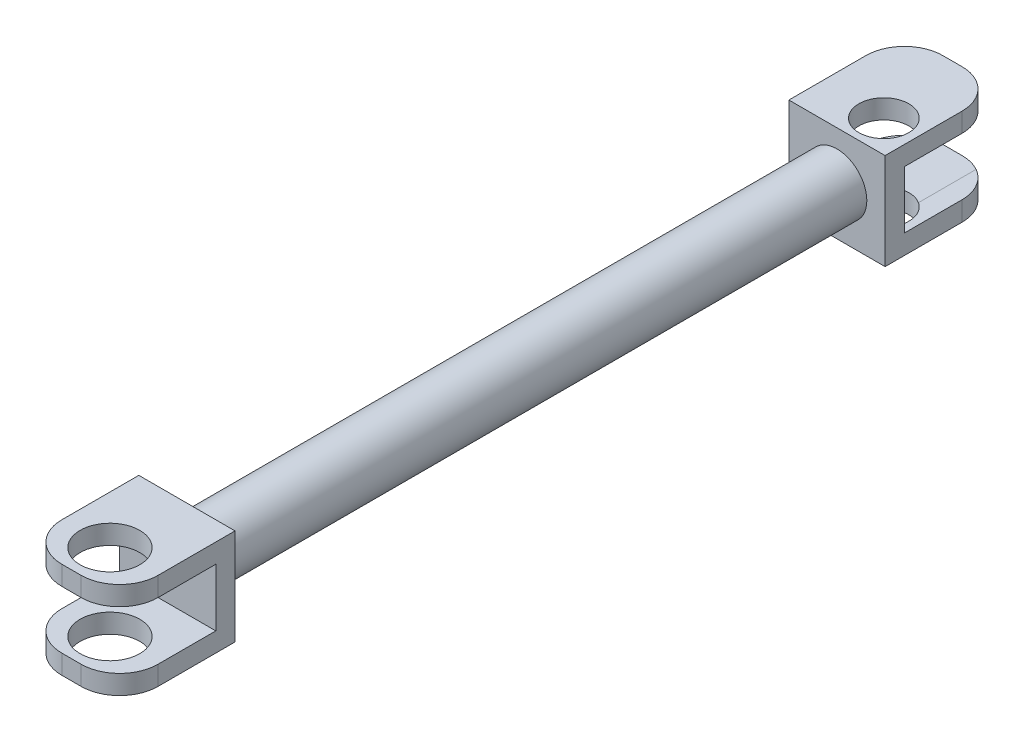
ISO-10303-21;
HEADER;
FILE_DESCRIPTION(('STEP AP214'),'2;1');
FILE_NAME('part.step','',(''),(''),'','','');
FILE_SCHEMA(('AUTOMOTIVE_DESIGN { 1 0 10303 214 1 1 1 1 }'));
ENDSEC;
DATA;
#1=APPLICATION_CONTEXT('core data for automotive mechanical design processes');
#2=APPLICATION_PROTOCOL_DEFINITION('international standard','automotive_design',2000,#1);
#3=PRODUCT_CONTEXT('',#1,'mechanical');
#4=PRODUCT('Part','Part','',(#3));
#5=PRODUCT_RELATED_PRODUCT_CATEGORY('part','',(#4));
#6=PRODUCT_DEFINITION_FORMATION('','',#4);
#7=PRODUCT_DEFINITION_CONTEXT('part definition',#1,'design');
#8=PRODUCT_DEFINITION('design','',#6,#7);
#9=PRODUCT_DEFINITION_SHAPE('','',#8);
#10=(LENGTH_UNIT() NAMED_UNIT(*) SI_UNIT(.MILLI.,.METRE.));
#11=(NAMED_UNIT(*) PLANE_ANGLE_UNIT() SI_UNIT($,.RADIAN.));
#12=(NAMED_UNIT(*) SI_UNIT($,.STERADIAN.) SOLID_ANGLE_UNIT());
#13=UNCERTAINTY_MEASURE_WITH_UNIT(LENGTH_MEASURE(1.E-05),#10,'distance_accuracy_value','');
#14=(GEOMETRIC_REPRESENTATION_CONTEXT(3) GLOBAL_UNCERTAINTY_ASSIGNED_CONTEXT((#13)) GLOBAL_UNIT_ASSIGNED_CONTEXT((#10,
#11,#12)) REPRESENTATION_CONTEXT('',''));
#15=CARTESIAN_POINT('',(0.,0.,0.));
#16=DIRECTION('',(0.,0.,1.));
#17=DIRECTION('',(1.,0.,0.));
#18=AXIS2_PLACEMENT_3D('',#15,#16,#17);
#19=CARTESIAN_POINT('',(0.,0.,0.));
#20=DIRECTION('',(0.,0.,1.));
#21=DIRECTION('',(1.,0.,0.));
#22=AXIS2_PLACEMENT_3D('',#19,#20,#21);
#23=PLANE('',#22);
#24=DIRECTION('',(1.,0.,0.));
#25=VECTOR('',#24,1.);
#26=CARTESIAN_POINT('',(0.,40.,0.));
#27=LINE('',#26,#25);
#28=CARTESIAN_POINT('',(0.,40.,0.));
#29=VERTEX_POINT('',#28);
#30=CARTESIAN_POINT('',(21.5929046500443,40.,0.));
#31=VERTEX_POINT('',#30);
#32=EDGE_CURVE('E240',#29,#31,#27,.T.);
#33=ORIENTED_EDGE('',*,*,#32,.T.);
#34=DIRECTION('',(0.,1.,0.));
#35=VECTOR('',#34,1.);
#36=CARTESIAN_POINT('',(21.5929046500443,-20.,0.));
#37=LINE('',#36,#35);
#38=CARTESIAN_POINT('',(21.5929046500443,10.,0.));
#39=VERTEX_POINT('',#38);
#40=EDGE_CURVE('E50',#31,#39,#37,.F.);
#41=ORIENTED_EDGE('',*,*,#40,.T.);
#42=DIRECTION('',(-1.,0.,0.));
#43=VECTOR('',#42,1.);
#44=CARTESIAN_POINT('',(9.99999999999999,10.,0.));
#45=LINE('',#44,#43);
#46=CARTESIAN_POINT('',(0.,10.,0.));
#47=VERTEX_POINT('',#46);
#48=EDGE_CURVE('E407',#39,#47,#45,.T.);
#49=ORIENTED_EDGE('',*,*,#48,.T.);
#50=DIRECTION('',(0.,-1.,0.));
#51=VECTOR('',#50,1.);
#52=CARTESIAN_POINT('',(0.,50.,0.));
#53=LINE('',#52,#51);
#54=EDGE_CURVE('E396',#29,#47,#53,.T.);
#55=ORIENTED_EDGE('',*,*,#54,.F.);
#56=EDGE_LOOP('',(#33,#41,#49,#55));
#57=FACE_BOUND('',#56,.T.);
#58=ADVANCED_FACE('F36',(#57),#23,.F.);
#59=CARTESIAN_POINT('',(0.,0.,357.81));
#60=DIRECTION('',(0.,0.,-1.));
#61=DIRECTION('',(-1.,0.,0.));
#62=AXIS2_PLACEMENT_3D('',#59,#60,#61);
#63=PLANE('',#62);
#64=DIRECTION('',(-1.,0.,0.));
#65=VECTOR('',#64,1.);
#66=CARTESIAN_POINT('',(0.,10.,357.81));
#67=LINE('',#66,#65);
#68=CARTESIAN_POINT('',(50.,10.,357.81));
#69=VERTEX_POINT('',#68);
#70=CARTESIAN_POINT('',(0.,10.,357.81));
#71=VERTEX_POINT('',#70);
#72=EDGE_CURVE('E292',#69,#71,#67,.T.);
#73=ORIENTED_EDGE('',*,*,#72,.F.);
#74=DIRECTION('',(0.,1.,0.));
#75=VECTOR('',#74,1.);
#76=CARTESIAN_POINT('',(50.,0.,357.81));
#77=LINE('',#76,#75);
#78=CARTESIAN_POINT('',(50.,40.,357.81));
#79=VERTEX_POINT('',#78);
#80=EDGE_CURVE('E338',#69,#79,#77,.T.);
#81=ORIENTED_EDGE('',*,*,#80,.T.);
#82=DIRECTION('',(-1.,0.,0.));
#83=VECTOR('',#82,1.);
#84=CARTESIAN_POINT('',(0.,40.,357.81));
#85=LINE('',#84,#83);
#86=CARTESIAN_POINT('',(0.,40.,357.81));
#87=VERTEX_POINT('',#86);
#88=EDGE_CURVE('E317',#79,#87,#85,.T.);
#89=ORIENTED_EDGE('',*,*,#88,.T.);
#90=DIRECTION('',(0.,-1.,0.));
#91=VECTOR('',#90,1.);
#92=CARTESIAN_POINT('',(0.,0.,357.81));
#93=LINE('',#92,#91);
#94=EDGE_CURVE('E58',#87,#71,#93,.T.);
#95=ORIENTED_EDGE('',*,*,#94,.T.);
#96=EDGE_LOOP('',(#73,#81,#89,#95));
#97=FACE_BOUND('',#96,.T.);
#98=ADVANCED_FACE('F539',(#97),#63,.F.);
#99=CARTESIAN_POINT('',(9.99999999999999,10.,-80.));
#100=DIRECTION('',(0.,-1.,0.));
#101=DIRECTION('',(1.,0.,0.));
#102=AXIS2_PLACEMENT_3D('',#99,#100,#101);
#103=PLANE('',#102);
#104=ORIENTED_EDGE('',*,*,#48,.F.);
#105=CARTESIAN_POINT('',(32.8523995565236,10.,-6.49798233692328));
#106=DIRECTION('',(0.,-1.,0.));
#107=DIRECTION('',(1.,0.,0.));
#108=AXIS2_PLACEMENT_3D('',#105,#106,#107);
#109=CIRCLE('',#108,13.);
#110=CARTESIAN_POINT('',(40.,10.,-17.3567026989372));
#111=VERTEX_POINT('',#110);
#112=EDGE_CURVE('E474',#39,#111,#109,.T.);
#113=ORIENTED_EDGE('',*,*,#112,.T.);
#114=DIRECTION('',(0.,0.,1.));
#115=VECTOR('',#114,1.);
#116=CARTESIAN_POINT('',(40.,10.,-80.));
#117=LINE('',#116,#115);
#118=CARTESIAN_POINT('',(40.,10.,-47.3205080756888));
#119=VERTEX_POINT('',#118);
#120=EDGE_CURVE('E423',#119,#111,#117,.T.);
#121=ORIENTED_EDGE('',*,*,#120,.F.);
#122=CARTESIAN_POINT('',(30.,10.,-30.));
#123=DIRECTION('',(0.,-1.,0.));
#124=DIRECTION('',(1.,0.,0.));
#125=AXIS2_PLACEMENT_3D('',#122,#123,#124);
#126=CIRCLE('',#125,20.);
#127=CARTESIAN_POINT('',(29.9999999999999,10.,-50.));
#128=VERTEX_POINT('',#127);
#129=EDGE_CURVE('E429',#128,#119,#126,.T.);
#130=ORIENTED_EDGE('',*,*,#129,.F.);
#131=DIRECTION('',(1.,0.,0.));
#132=VECTOR('',#131,1.);
#133=CARTESIAN_POINT('',(20.0000000000001,10.,-50.));
#134=LINE('',#133,#132);
#135=CARTESIAN_POINT('',(20.0000000000001,10.,-50.));
#136=VERTEX_POINT('',#135);
#137=EDGE_CURVE('E426',#136,#128,#134,.T.);
#138=ORIENTED_EDGE('',*,*,#137,.F.);
#139=CARTESIAN_POINT('',(20.,10.,-30.));
#140=DIRECTION('',(0.,-1.,0.));
#141=DIRECTION('',(1.,0.,0.));
#142=AXIS2_PLACEMENT_3D('',#139,#140,#141);
#143=CIRCLE('',#142,20.);
#144=CARTESIAN_POINT('',(0.,10.,-29.9999999999999));
#145=VERTEX_POINT('',#144);
#146=EDGE_CURVE('E461',#145,#136,#143,.T.);
#147=ORIENTED_EDGE('',*,*,#146,.F.);
#148=DIRECTION('',(0.,0.,1.));
#149=VECTOR('',#148,1.);
#150=CARTESIAN_POINT('',(0.,10.,-80.));
#151=LINE('',#150,#149);
#152=EDGE_CURVE('E411',#145,#47,#151,.T.);
#153=ORIENTED_EDGE('',*,*,#152,.T.);
#154=EDGE_LOOP('',(#104,#113,#121,#130,#138,#147,#153));
#155=FACE_BOUND('',#154,.T.);
#156=ADVANCED_FACE('F473',(#155),#103,.F.);
#157=CARTESIAN_POINT('',(40.,40.,-80.));
#158=DIRECTION('',(-1.,0.,0.));
#159=DIRECTION('',(0.,0.,1.));
#160=AXIS2_PLACEMENT_3D('',#157,#158,#159);
#161=PLANE('',#160);
#162=DIRECTION('',(0.,1.,0.));
#163=VECTOR('',#162,1.);
#164=CARTESIAN_POINT('',(40.,-20.,-17.3567026989372));
#165=LINE('',#164,#163);
#166=CARTESIAN_POINT('',(40.,10.1393836186026,-17.3567026989372));
#167=VERTEX_POINT('',#166);
#168=EDGE_CURVE('E491',#167,#111,#165,.F.);
#169=ORIENTED_EDGE('',*,*,#168,.F.);
#170=DIRECTION('',(0.,0.,1.));
#171=VECTOR('',#170,1.);
#172=CARTESIAN_POINT('',(40.,10.1393836186026,-80.));
#173=LINE('',#172,#171);
#174=CARTESIAN_POINT('',(40.,10.1393836186026,-47.3205080756888));
#175=VERTEX_POINT('',#174);
#176=EDGE_CURVE('E416',#175,#167,#173,.T.);
#177=ORIENTED_EDGE('',*,*,#176,.F.);
#178=DIRECTION('',(0.,-1.,0.));
#179=VECTOR('',#178,1.);
#180=CARTESIAN_POINT('',(40.,50.,-47.3205080756888));
#181=LINE('',#180,#179);
#182=EDGE_CURVE('E242',#175,#119,#181,.T.);
#183=ORIENTED_EDGE('',*,*,#182,.T.);
#184=ORIENTED_EDGE('',*,*,#120,.T.);
#185=EDGE_LOOP('',(#169,#177,#183,#184));
#186=FACE_BOUND('',#185,.T.);
#187=ADVANCED_FACE('F468',(#186),#161,.T.);
#188=CARTESIAN_POINT('',(40.,10.1393836186026,-80.));
#189=DIRECTION('',(0.,-1.,0.));
#190=DIRECTION('',(0.,0.,-1.));
#191=AXIS2_PLACEMENT_3D('',#188,#189,#190);
#192=PLANE('',#191);
#193=ORIENTED_EDGE('',*,*,#176,.T.);
#194=CARTESIAN_POINT('',(32.8523995565236,10.1393836186026,-6.49798233692328));
#195=DIRECTION('',(0.,-1.,0.));
#196=DIRECTION('',(0.,0.,-1.));
#197=AXIS2_PLACEMENT_3D('',#194,#195,#196);
#198=CIRCLE('',#197,13.);
#199=CARTESIAN_POINT('',(44.1118944630029,10.1393836186026,0.));
#200=VERTEX_POINT('',#199);
#201=EDGE_CURVE('E233',#167,#200,#198,.T.);
#202=ORIENTED_EDGE('',*,*,#201,.T.);
#203=DIRECTION('',(-1.,0.,0.));
#204=VECTOR('',#203,1.);
#205=CARTESIAN_POINT('',(40.,10.1393836186026,0.));
#206=LINE('',#205,#204);
#207=CARTESIAN_POINT('',(50.,10.1393836186026,0.));
#208=VERTEX_POINT('',#207);
#209=EDGE_CURVE('E232',#208,#200,#206,.T.);
#210=ORIENTED_EDGE('',*,*,#209,.F.);
#211=DIRECTION('',(0.,0.,1.));
#212=VECTOR('',#211,1.);
#213=CARTESIAN_POINT('',(50.,10.1393836186026,-80.));
#214=LINE('',#213,#212);
#215=CARTESIAN_POINT('',(50.,10.1393836186026,-29.9999999999999));
#216=VERTEX_POINT('',#215);
#217=EDGE_CURVE('E412',#216,#208,#214,.T.);
#218=ORIENTED_EDGE('',*,*,#217,.F.);
#219=CARTESIAN_POINT('',(30.,10.1393836186026,-30.));
#220=DIRECTION('',(0.,-1.,0.));
#221=DIRECTION('',(0.,0.,-1.));
#222=AXIS2_PLACEMENT_3D('',#219,#220,#221);
#223=CIRCLE('',#222,20.);
#224=EDGE_CURVE('E415',#175,#216,#223,.T.);
#225=ORIENTED_EDGE('',*,*,#224,.F.);
#226=EDGE_LOOP('',(#193,#202,#210,#218,#225));
#227=FACE_BOUND('',#226,.T.);
#228=ADVANCED_FACE('F561',(#227),#192,.F.);
#229=CARTESIAN_POINT('',(0.,0.,10.));
#230=DIRECTION('',(0.,1.,0.));
#231=DIRECTION('',(0.,0.,1.));
#232=AXIS2_PLACEMENT_3D('',#229,#230,#231);
#233=PLANE('',#232);
#234=CARTESIAN_POINT('',(32.8523995565236,0.,-6.49798233692328));
#235=DIRECTION('',(0.,1.,0.));
#236=DIRECTION('',(0.,0.,1.));
#237=AXIS2_PLACEMENT_3D('',#234,#235,#236);
#238=CIRCLE('',#237,13.);
#239=CARTESIAN_POINT('',(32.8523995565236,0.,6.50201766307672));
#240=VERTEX_POINT('',#239);
#241=EDGE_CURVE('E255',#240,#240,#238,.T.);
#242=ORIENTED_EDGE('',*,*,#241,.T.);
#243=EDGE_LOOP('',(#242));
#244=FACE_BOUND('',#243,.T.);
#245=DIRECTION('',(0.,0.,-1.));
#246=VECTOR('',#245,1.);
#247=CARTESIAN_POINT('',(0.,0.,10.));
#248=LINE('',#247,#246);
#249=CARTESIAN_POINT('',(0.,0.,10.));
#250=VERTEX_POINT('',#249);
#251=CARTESIAN_POINT('',(0.,0.,-29.9999999999999));
#252=VERTEX_POINT('',#251);
#253=EDGE_CURVE('E459',#250,#252,#248,.T.);
#254=ORIENTED_EDGE('',*,*,#253,.T.);
#255=CARTESIAN_POINT('',(20.,0.,-30.));
#256=DIRECTION('',(0.,1.,0.));
#257=DIRECTION('',(0.,0.,1.));
#258=AXIS2_PLACEMENT_3D('',#255,#256,#257);
#259=CIRCLE('',#258,20.);
#260=CARTESIAN_POINT('',(20.0000000000001,0.,-50.));
#261=VERTEX_POINT('',#260);
#262=EDGE_CURVE('E438',#261,#252,#259,.T.);
#263=ORIENTED_EDGE('',*,*,#262,.F.);
#264=DIRECTION('',(-1.,0.,0.));
#265=VECTOR('',#264,1.);
#266=CARTESIAN_POINT('',(20.0000000000001,0.,-50.));
#267=LINE('',#266,#265);
#268=CARTESIAN_POINT('',(29.9999999999999,0.,-50.));
#269=VERTEX_POINT('',#268);
#270=EDGE_CURVE('E435',#269,#261,#267,.T.);
#271=ORIENTED_EDGE('',*,*,#270,.F.);
#272=CARTESIAN_POINT('',(30.,0.,-30.));
#273=DIRECTION('',(0.,1.,0.));
#274=DIRECTION('',(0.,0.,1.));
#275=AXIS2_PLACEMENT_3D('',#272,#273,#274);
#276=CIRCLE('',#275,20.);
#277=CARTESIAN_POINT('',(50.,0.,-29.9999999999999));
#278=VERTEX_POINT('',#277);
#279=EDGE_CURVE('E432',#278,#269,#276,.T.);
#280=ORIENTED_EDGE('',*,*,#279,.F.);
#281=DIRECTION('',(0.,0.,-1.));
#282=VECTOR('',#281,1.);
#283=CARTESIAN_POINT('',(50.,0.,10.));
#284=LINE('',#283,#282);
#285=CARTESIAN_POINT('',(50.,0.,10.));
#286=VERTEX_POINT('',#285);
#287=EDGE_CURVE('E457',#286,#278,#284,.T.);
#288=ORIENTED_EDGE('',*,*,#287,.F.);
#289=DIRECTION('',(1.,0.,0.));
#290=VECTOR('',#289,1.);
#291=CARTESIAN_POINT('',(0.,0.,10.));
#292=LINE('',#291,#290);
#293=EDGE_CURVE('E453',#250,#286,#292,.T.);
#294=ORIENTED_EDGE('',*,*,#293,.F.);
#295=EDGE_LOOP('',(#254,#263,#271,#280,#288,#294));
#296=FACE_BOUND('',#295,.T.);
#297=ADVANCED_FACE('F559',(#244,#296),#233,.F.);
#298=CARTESIAN_POINT('',(20.0000000000001,50.,-50.));
#299=DIRECTION('',(0.,0.,1.));
#300=DIRECTION('',(1.,0.,0.));
#301=AXIS2_PLACEMENT_3D('',#298,#299,#300);
#302=PLANE('',#301);
#303=DIRECTION('',(0.,-1.,0.));
#304=VECTOR('',#303,1.);
#305=CARTESIAN_POINT('',(20.0000000000001,50.,-50.));
#306=LINE('',#305,#304);
#307=EDGE_CURVE('E444',#136,#261,#306,.T.);
#308=ORIENTED_EDGE('',*,*,#307,.F.);
#309=ORIENTED_EDGE('',*,*,#137,.T.);
#310=DIRECTION('',(0.,-1.,0.));
#311=VECTOR('',#310,1.);
#312=CARTESIAN_POINT('',(29.9999999999999,50.,-50.));
#313=LINE('',#312,#311);
#314=EDGE_CURVE('E446',#128,#269,#313,.T.);
#315=ORIENTED_EDGE('',*,*,#314,.T.);
#316=ORIENTED_EDGE('',*,*,#270,.T.);
#317=EDGE_LOOP('',(#308,#309,#315,#316));
#318=FACE_BOUND('',#317,.T.);
#319=ADVANCED_FACE('F481',(#318),#302,.F.);
#320=CARTESIAN_POINT('',(50.,0.,10.));
#321=DIRECTION('',(-1.,0.,0.));
#322=DIRECTION('',(0.,-1.,0.));
#323=AXIS2_PLACEMENT_3D('',#320,#321,#322);
#324=PLANE('',#323);
#325=DIRECTION('',(0.,1.,0.));
#326=VECTOR('',#325,1.);
#327=CARTESIAN_POINT('',(50.,50.,0.));
#328=LINE('',#327,#326);
#329=CARTESIAN_POINT('',(50.,40.,0.));
#330=VERTEX_POINT('',#329);
#331=EDGE_CURVE('E399',#208,#330,#328,.T.);
#332=ORIENTED_EDGE('',*,*,#331,.T.);
#333=DIRECTION('',(0.,0.,1.));
#334=VECTOR('',#333,1.);
#335=CARTESIAN_POINT('',(50.,40.,-80.));
#336=LINE('',#335,#334);
#337=CARTESIAN_POINT('',(50.,40.,-29.9999999999999));
#338=VERTEX_POINT('',#337);
#339=EDGE_CURVE('E238',#338,#330,#336,.T.);
#340=ORIENTED_EDGE('',*,*,#339,.F.);
#341=DIRECTION('',(0.,-1.,0.));
#342=VECTOR('',#341,1.);
#343=CARTESIAN_POINT('',(50.,50.,-29.9999999999999));
#344=LINE('',#343,#342);
#345=CARTESIAN_POINT('',(50.,50.,-29.9999999999999));
#346=VERTEX_POINT('',#345);
#347=EDGE_CURVE('E362',#346,#338,#344,.T.);
#348=ORIENTED_EDGE('',*,*,#347,.F.);
#349=DIRECTION('',(0.,0.,1.));
#350=VECTOR('',#349,1.);
#351=CARTESIAN_POINT('',(50.,50.,0.));
#352=LINE('',#351,#350);
#353=CARTESIAN_POINT('',(50.,50.,10.));
#354=VERTEX_POINT('',#353);
#355=EDGE_CURVE('E401',#346,#354,#352,.T.);
#356=ORIENTED_EDGE('',*,*,#355,.T.);
#357=DIRECTION('',(0.,1.,0.));
#358=VECTOR('',#357,1.);
#359=CARTESIAN_POINT('',(50.,0.,10.));
#360=LINE('',#359,#358);
#361=EDGE_CURVE('E455',#286,#354,#360,.T.);
#362=ORIENTED_EDGE('',*,*,#361,.F.);
#363=ORIENTED_EDGE('',*,*,#287,.T.);
#364=DIRECTION('',(0.,-1.,0.));
#365=VECTOR('',#364,1.);
#366=CARTESIAN_POINT('',(50.,50.,-29.9999999999999));
#367=LINE('',#366,#365);
#368=EDGE_CURVE('E448',#216,#278,#367,.T.);
#369=ORIENTED_EDGE('',*,*,#368,.F.);
#370=ORIENTED_EDGE('',*,*,#217,.T.);
#371=EDGE_LOOP('',(#332,#340,#348,#356,#362,#363,#369,#370));
#372=FACE_BOUND('',#371,.T.);
#373=ADVANCED_FACE('F512',(#372),#324,.F.);
#374=CARTESIAN_POINT('',(0.,0.,10.));
#375=DIRECTION('',(1.,0.,0.));
#376=DIRECTION('',(0.,1.,0.));
#377=AXIS2_PLACEMENT_3D('',#374,#375,#376);
#378=PLANE('',#377);
#379=ORIENTED_EDGE('',*,*,#253,.F.);
#380=DIRECTION('',(0.,-1.,0.));
#381=VECTOR('',#380,1.);
#382=CARTESIAN_POINT('',(0.,0.,10.));
#383=LINE('',#382,#381);
#384=CARTESIAN_POINT('',(0.,50.,10.));
#385=VERTEX_POINT('',#384);
#386=EDGE_CURVE('E451',#385,#250,#383,.T.);
#387=ORIENTED_EDGE('',*,*,#386,.F.);
#388=DIRECTION('',(0.,0.,1.));
#389=VECTOR('',#388,1.);
#390=CARTESIAN_POINT('',(0.,50.,0.));
#391=LINE('',#390,#389);
#392=CARTESIAN_POINT('',(0.,50.,-29.9999999999999));
#393=VERTEX_POINT('',#392);
#394=EDGE_CURVE('E404',#393,#385,#391,.T.);
#395=ORIENTED_EDGE('',*,*,#394,.F.);
#396=DIRECTION('',(0.,-1.,0.));
#397=VECTOR('',#396,1.);
#398=CARTESIAN_POINT('',(0.,50.,-29.9999999999999));
#399=LINE('',#398,#397);
#400=CARTESIAN_POINT('',(0.,40.,-29.9999999999999));
#401=VERTEX_POINT('',#400);
#402=EDGE_CURVE('E385',#393,#401,#399,.T.);
#403=ORIENTED_EDGE('',*,*,#402,.T.);
#404=DIRECTION('',(0.,0.,1.));
#405=VECTOR('',#404,1.);
#406=CARTESIAN_POINT('',(0.,40.,-80.));
#407=LINE('',#406,#405);
#408=EDGE_CURVE('E373',#401,#29,#407,.T.);
#409=ORIENTED_EDGE('',*,*,#408,.T.);
#410=ORIENTED_EDGE('',*,*,#54,.T.);
#411=ORIENTED_EDGE('',*,*,#152,.F.);
#412=DIRECTION('',(0.,-1.,0.));
#413=VECTOR('',#412,1.);
#414=CARTESIAN_POINT('',(0.,50.,-29.9999999999999));
#415=LINE('',#414,#413);
#416=EDGE_CURVE('E441',#145,#252,#415,.T.);
#417=ORIENTED_EDGE('',*,*,#416,.T.);
#418=EDGE_LOOP('',(#379,#387,#395,#403,#409,#410,#411,#417));
#419=FACE_BOUND('',#418,.T.);
#420=ADVANCED_FACE('F38',(#419),#378,.F.);
#421=CARTESIAN_POINT('',(20.,50.,-30.));
#422=DIRECTION('',(0.,-1.,0.));
#423=DIRECTION('',(0.,0.,-1.));
#424=AXIS2_PLACEMENT_3D('',#421,#422,#423);
#425=CYLINDRICAL_SURFACE('',#424,20.);
#426=ORIENTED_EDGE('',*,*,#416,.F.);
#427=ORIENTED_EDGE('',*,*,#146,.T.);
#428=ORIENTED_EDGE('',*,*,#307,.T.);
#429=ORIENTED_EDGE('',*,*,#262,.T.);
#430=EDGE_LOOP('',(#426,#427,#428,#429));
#431=FACE_BOUND('',#430,.T.);
#432=ADVANCED_FACE('F486',(#431),#425,.T.);
#433=CARTESIAN_POINT('',(30.,50.,-30.));
#434=DIRECTION('',(0.,-1.,0.));
#435=DIRECTION('',(0.,0.,-1.));
#436=AXIS2_PLACEMENT_3D('',#433,#434,#435);
#437=CYLINDRICAL_SURFACE('',#436,20.);
#438=ORIENTED_EDGE('',*,*,#182,.F.);
#439=ORIENTED_EDGE('',*,*,#224,.T.);
#440=ORIENTED_EDGE('',*,*,#368,.T.);
#441=ORIENTED_EDGE('',*,*,#279,.T.);
#442=ORIENTED_EDGE('',*,*,#314,.F.);
#443=ORIENTED_EDGE('',*,*,#129,.T.);
#444=EDGE_LOOP('',(#438,#439,#440,#441,#442,#443));
#445=FACE_BOUND('',#444,.T.);
#446=ADVANCED_FACE('F476',(#445),#437,.T.);
#447=CARTESIAN_POINT('',(0.,0.,10.));
#448=DIRECTION('',(0.,0.,-1.));
#449=DIRECTION('',(-1.,0.,0.));
#450=AXIS2_PLACEMENT_3D('',#447,#448,#449);
#451=PLANE('',#450);
#452=CARTESIAN_POINT('',(25.,25.,10.));
#453=DIRECTION('',(0.,0.,1.));
#454=DIRECTION('',(1.,0.,0.));
#455=AXIS2_PLACEMENT_3D('',#452,#453,#454);
#456=CIRCLE('',#455,15.5);
#457=CARTESIAN_POINT('',(40.5,25.,10.));
#458=VERTEX_POINT('',#457);
#459=EDGE_CURVE('E44',#458,#458,#456,.T.);
#460=ORIENTED_EDGE('',*,*,#459,.F.);
#461=EDGE_LOOP('',(#460));
#462=FACE_BOUND('',#461,.T.);
#463=ORIENTED_EDGE('',*,*,#361,.T.);
#464=DIRECTION('',(-1.,0.,0.));
#465=VECTOR('',#464,1.);
#466=CARTESIAN_POINT('',(0.,50.,10.));
#467=LINE('',#466,#465);
#468=EDGE_CURVE('E387',#354,#385,#467,.T.);
#469=ORIENTED_EDGE('',*,*,#468,.T.);
#470=ORIENTED_EDGE('',*,*,#386,.T.);
#471=ORIENTED_EDGE('',*,*,#293,.T.);
#472=EDGE_LOOP('',(#463,#469,#470,#471));
#473=FACE_BOUND('',#472,.T.);
#474=ADVANCED_FACE('F507',(#462,#473),#451,.F.);
#475=ORIENTED_EDGE('',*,*,#209,.T.);
#476=DIRECTION('',(0.,1.,0.));
#477=VECTOR('',#476,1.);
#478=CARTESIAN_POINT('',(44.1118944630029,-20.,0.));
#479=LINE('',#478,#477);
#480=CARTESIAN_POINT('',(44.1118944630029,40.,0.));
#481=VERTEX_POINT('',#480);
#482=EDGE_CURVE('E221',#200,#481,#479,.T.);
#483=ORIENTED_EDGE('',*,*,#482,.T.);
#484=EDGE_CURVE('E230',#481,#330,#27,.T.);
#485=ORIENTED_EDGE('',*,*,#484,.T.);
#486=ORIENTED_EDGE('',*,*,#331,.F.);
#487=EDGE_LOOP('',(#475,#483,#485,#486));
#488=FACE_BOUND('',#487,.T.);
#489=ADVANCED_FACE('F228',(#488),#23,.F.);
#490=CARTESIAN_POINT('',(0.,50.,0.));
#491=DIRECTION('',(0.,1.,0.));
#492=DIRECTION('',(0.,0.,1.));
#493=AXIS2_PLACEMENT_3D('',#490,#491,#492);
#494=PLANE('',#493);
#495=CARTESIAN_POINT('',(32.8523995565236,50.,-6.49798233692328));
#496=DIRECTION('',(0.,1.,0.));
#497=DIRECTION('',(0.,0.,1.));
#498=AXIS2_PLACEMENT_3D('',#495,#496,#497);
#499=CIRCLE('',#498,13.);
#500=CARTESIAN_POINT('',(32.8523995565236,50.,6.50201766307672));
#501=VERTEX_POINT('',#500);
#502=EDGE_CURVE('E234',#501,#501,#499,.T.);
#503=ORIENTED_EDGE('',*,*,#502,.F.);
#504=EDGE_LOOP('',(#503));
#505=FACE_BOUND('',#504,.T.);
#506=ORIENTED_EDGE('',*,*,#468,.F.);
#507=ORIENTED_EDGE('',*,*,#355,.F.);
#508=CARTESIAN_POINT('',(30.,50.,-30.));
#509=DIRECTION('',(0.,1.,0.));
#510=DIRECTION('',(0.,0.,1.));
#511=AXIS2_PLACEMENT_3D('',#508,#509,#510);
#512=CIRCLE('',#511,20.);
#513=CARTESIAN_POINT('',(29.9999999999999,50.,-50.));
#514=VERTEX_POINT('',#513);
#515=EDGE_CURVE('E371',#346,#514,#512,.T.);
#516=ORIENTED_EDGE('',*,*,#515,.T.);
#517=DIRECTION('',(-1.,0.,0.));
#518=VECTOR('',#517,1.);
#519=CARTESIAN_POINT('',(20.0000000000001,50.,-50.));
#520=LINE('',#519,#518);
#521=CARTESIAN_POINT('',(20.0000000000001,50.,-50.));
#522=VERTEX_POINT('',#521);
#523=EDGE_CURVE('E369',#514,#522,#520,.T.);
#524=ORIENTED_EDGE('',*,*,#523,.T.);
#525=CARTESIAN_POINT('',(20.,50.,-30.));
#526=DIRECTION('',(0.,1.,0.));
#527=DIRECTION('',(0.,0.,1.));
#528=AXIS2_PLACEMENT_3D('',#525,#526,#527);
#529=CIRCLE('',#528,20.);
#530=EDGE_CURVE('E365',#522,#393,#529,.T.);
#531=ORIENTED_EDGE('',*,*,#530,.T.);
#532=ORIENTED_EDGE('',*,*,#394,.T.);
#533=EDGE_LOOP('',(#506,#507,#516,#524,#531,#532));
#534=FACE_BOUND('',#533,.T.);
#535=ADVANCED_FACE('F500',(#505,#534),#494,.T.);
#536=CARTESIAN_POINT('',(9.99999999999999,40.,-80.));
#537=DIRECTION('',(0.,-1.,0.));
#538=DIRECTION('',(0.,0.,-1.));
#539=AXIS2_PLACEMENT_3D('',#536,#537,#538);
#540=PLANE('',#539);
#541=CARTESIAN_POINT('',(32.8523995565236,40.,-6.49798233692328));
#542=DIRECTION('',(0.,-1.,0.));
#543=DIRECTION('',(0.,0.,-1.));
#544=AXIS2_PLACEMENT_3D('',#541,#542,#543);
#545=CIRCLE('',#544,13.);
#546=EDGE_CURVE('E11',#31,#481,#545,.T.);
#547=ORIENTED_EDGE('',*,*,#546,.F.);
#548=ORIENTED_EDGE('',*,*,#32,.F.);
#549=ORIENTED_EDGE('',*,*,#408,.F.);
#550=CARTESIAN_POINT('',(20.,40.,-30.));
#551=DIRECTION('',(0.,1.,0.));
#552=DIRECTION('',(0.,0.,1.));
#553=AXIS2_PLACEMENT_3D('',#550,#551,#552);
#554=CIRCLE('',#553,20.);
#555=CARTESIAN_POINT('',(20.,40.,-50.));
#556=VERTEX_POINT('',#555);
#557=EDGE_CURVE('E379',#556,#401,#554,.T.);
#558=ORIENTED_EDGE('',*,*,#557,.F.);
#559=DIRECTION('',(1.,0.,0.));
#560=VECTOR('',#559,1.);
#561=CARTESIAN_POINT('',(20.0000000000001,40.,-50.));
#562=LINE('',#561,#560);
#563=CARTESIAN_POINT('',(29.9999999999999,40.,-50.));
#564=VERTEX_POINT('',#563);
#565=EDGE_CURVE('E368',#556,#564,#562,.T.);
#566=ORIENTED_EDGE('',*,*,#565,.T.);
#567=CARTESIAN_POINT('',(30.,40.,-30.));
#568=DIRECTION('',(0.,1.,0.));
#569=DIRECTION('',(0.,0.,1.));
#570=AXIS2_PLACEMENT_3D('',#567,#568,#569);
#571=CIRCLE('',#570,20.);
#572=EDGE_CURVE('E376',#338,#564,#571,.T.);
#573=ORIENTED_EDGE('',*,*,#572,.F.);
#574=ORIENTED_EDGE('',*,*,#339,.T.);
#575=ORIENTED_EDGE('',*,*,#484,.F.);
#576=EDGE_LOOP('',(#547,#548,#549,#558,#566,#573,#574,#575));
#577=FACE_BOUND('',#576,.T.);
#578=ADVANCED_FACE('F236',(#577),#540,.T.);
#579=CARTESIAN_POINT('',(30.,50.,-30.));
#580=DIRECTION('',(0.,-1.,0.));
#581=DIRECTION('',(0.,0.,-1.));
#582=AXIS2_PLACEMENT_3D('',#579,#580,#581);
#583=CYLINDRICAL_SURFACE('',#582,20.);
#584=ORIENTED_EDGE('',*,*,#347,.T.);
#585=ORIENTED_EDGE('',*,*,#572,.T.);
#586=DIRECTION('',(0.,-1.,0.));
#587=VECTOR('',#586,1.);
#588=CARTESIAN_POINT('',(29.9999999999999,50.,-50.));
#589=LINE('',#588,#587);
#590=EDGE_CURVE('E378',#514,#564,#589,.T.);
#591=ORIENTED_EDGE('',*,*,#590,.F.);
#592=ORIENTED_EDGE('',*,*,#515,.F.);
#593=EDGE_LOOP('',(#584,#585,#591,#592));
#594=FACE_BOUND('',#593,.T.);
#595=ADVANCED_FACE('F516',(#594),#583,.T.);
#596=CARTESIAN_POINT('',(20.0000000000001,50.,-50.));
#597=DIRECTION('',(0.,0.,1.));
#598=DIRECTION('',(1.,0.,0.));
#599=AXIS2_PLACEMENT_3D('',#596,#597,#598);
#600=PLANE('',#599);
#601=ORIENTED_EDGE('',*,*,#565,.F.);
#602=DIRECTION('',(0.,-1.,0.));
#603=VECTOR('',#602,1.);
#604=CARTESIAN_POINT('',(20.0000000000001,50.,-50.));
#605=LINE('',#604,#603);
#606=EDGE_CURVE('E382',#522,#556,#605,.T.);
#607=ORIENTED_EDGE('',*,*,#606,.F.);
#608=ORIENTED_EDGE('',*,*,#523,.F.);
#609=ORIENTED_EDGE('',*,*,#590,.T.);
#610=EDGE_LOOP('',(#601,#607,#608,#609));
#611=FACE_BOUND('',#610,.T.);
#612=ADVANCED_FACE('F523',(#611),#600,.F.);
#613=CARTESIAN_POINT('',(20.,50.,-30.));
#614=DIRECTION('',(0.,-1.,0.));
#615=DIRECTION('',(0.,0.,-1.));
#616=AXIS2_PLACEMENT_3D('',#613,#614,#615);
#617=CYLINDRICAL_SURFACE('',#616,20.);
#618=ORIENTED_EDGE('',*,*,#606,.T.);
#619=ORIENTED_EDGE('',*,*,#557,.T.);
#620=ORIENTED_EDGE('',*,*,#402,.F.);
#621=ORIENTED_EDGE('',*,*,#530,.F.);
#622=EDGE_LOOP('',(#618,#619,#620,#621));
#623=FACE_BOUND('',#622,.T.);
#624=ADVANCED_FACE('F525',(#623),#617,.T.);
#625=CARTESIAN_POINT('',(25.,25.,347.81));
#626=DIRECTION('',(0.,0.,-1.));
#627=DIRECTION('',(-1.,0.,0.));
#628=AXIS2_PLACEMENT_3D('',#625,#626,#627);
#629=CYLINDRICAL_SURFACE('',#628,15.5);
#630=CARTESIAN_POINT('',(25.,25.,347.81));
#631=DIRECTION('',(0.,0.,1.));
#632=DIRECTION('',(1.,0.,0.));
#633=AXIS2_PLACEMENT_3D('',#630,#631,#632);
#634=CIRCLE('',#633,15.5);
#635=CARTESIAN_POINT('',(40.5,25.,347.81));
#636=VERTEX_POINT('',#635);
#637=EDGE_CURVE('E359',#636,#636,#634,.T.);
#638=ORIENTED_EDGE('',*,*,#637,.F.);
#639=EDGE_LOOP('',(#638));
#640=FACE_BOUND('',#639,.T.);
#641=ORIENTED_EDGE('',*,*,#459,.T.);
#642=EDGE_LOOP('',(#641));
#643=FACE_BOUND('',#642,.T.);
#644=ADVANCED_FACE('F527',(#640,#643),#629,.T.);
#645=CARTESIAN_POINT('',(0.,0.,357.81));
#646=DIRECTION('',(1.,0.,0.));
#647=DIRECTION('',(0.,0.,-1.));
#648=AXIS2_PLACEMENT_3D('',#645,#646,#647);
#649=PLANE('',#648);
#650=DIRECTION('',(0.,0.,-1.));
#651=VECTOR('',#650,1.);
#652=CARTESIAN_POINT('',(0.,0.,357.81));
#653=LINE('',#652,#651);
#654=CARTESIAN_POINT('',(0.,0.,387.81));
#655=VERTEX_POINT('',#654);
#656=CARTESIAN_POINT('',(0.,0.,347.81));
#657=VERTEX_POINT('',#656);
#658=EDGE_CURVE('E356',#655,#657,#653,.T.);
#659=ORIENTED_EDGE('',*,*,#658,.F.);
#660=DIRECTION('',(0.,-1.,0.));
#661=VECTOR('',#660,1.);
#662=CARTESIAN_POINT('',(0.,10.,387.81));
#663=LINE('',#662,#661);
#664=CARTESIAN_POINT('',(0.,10.,387.81));
#665=VERTEX_POINT('',#664);
#666=EDGE_CURVE('E289',#665,#655,#663,.T.);
#667=ORIENTED_EDGE('',*,*,#666,.F.);
#668=DIRECTION('',(0.,0.,-1.));
#669=VECTOR('',#668,1.);
#670=CARTESIAN_POINT('',(0.,10.,347.81));
#671=LINE('',#670,#669);
#672=EDGE_CURVE('E266',#665,#71,#671,.T.);
#673=ORIENTED_EDGE('',*,*,#672,.T.);
#674=ORIENTED_EDGE('',*,*,#94,.F.);
#675=DIRECTION('',(0.,0.,1.));
#676=VECTOR('',#675,1.);
#677=CARTESIAN_POINT('',(0.,40.,357.81));
#678=LINE('',#677,#676);
#679=CARTESIAN_POINT('',(0.,40.,387.81));
#680=VERTEX_POINT('',#679);
#681=EDGE_CURVE('E301',#87,#680,#678,.T.);
#682=ORIENTED_EDGE('',*,*,#681,.T.);
#683=DIRECTION('',(0.,1.,0.));
#684=VECTOR('',#683,1.);
#685=CARTESIAN_POINT('',(0.,40.,387.81));
#686=LINE('',#685,#684);
#687=CARTESIAN_POINT('',(0.,50.,387.81));
#688=VERTEX_POINT('',#687);
#689=EDGE_CURVE('E319',#680,#688,#686,.T.);
#690=ORIENTED_EDGE('',*,*,#689,.T.);
#691=DIRECTION('',(0.,0.,-1.));
#692=VECTOR('',#691,1.);
#693=CARTESIAN_POINT('',(0.,50.,357.81));
#694=LINE('',#693,#692);
#695=CARTESIAN_POINT('',(0.,50.,347.81));
#696=VERTEX_POINT('',#695);
#697=EDGE_CURVE('E341',#688,#696,#694,.T.);
#698=ORIENTED_EDGE('',*,*,#697,.T.);
#699=DIRECTION('',(0.,-1.,0.));
#700=VECTOR('',#699,1.);
#701=CARTESIAN_POINT('',(0.,0.,347.81));
#702=LINE('',#701,#700);
#703=EDGE_CURVE('E330',#696,#657,#702,.T.);
#704=ORIENTED_EDGE('',*,*,#703,.T.);
#705=EDGE_LOOP('',(#659,#667,#673,#674,#682,#690,#698,#704));
#706=FACE_BOUND('',#705,.T.);
#707=ADVANCED_FACE('F533',(#706),#649,.F.);
#708=CARTESIAN_POINT('',(0.,0.,357.81));
#709=DIRECTION('',(0.,1.,0.));
#710=DIRECTION('',(0.,0.,1.));
#711=AXIS2_PLACEMENT_3D('',#708,#709,#710);
#712=PLANE('',#711);
#713=CARTESIAN_POINT('',(25.,0.,387.81));
#714=DIRECTION('',(0.,-1.,0.));
#715=DIRECTION('',(0.,0.,-1.));
#716=AXIS2_PLACEMENT_3D('',#713,#714,#715);
#717=CIRCLE('',#716,15.5);
#718=CARTESIAN_POINT('',(25.,0.,372.31));
#719=VERTEX_POINT('',#718);
#720=EDGE_CURVE('E248',#719,#719,#717,.T.);
#721=ORIENTED_EDGE('',*,*,#720,.F.);
#722=EDGE_LOOP('',(#721));
#723=FACE_BOUND('',#722,.T.);
#724=DIRECTION('',(1.,0.,0.));
#725=VECTOR('',#724,1.);
#726=CARTESIAN_POINT('',(0.,0.,347.81));
#727=LINE('',#726,#725);
#728=CARTESIAN_POINT('',(50.,0.,347.81));
#729=VERTEX_POINT('',#728);
#730=EDGE_CURVE('E343',#657,#729,#727,.T.);
#731=ORIENTED_EDGE('',*,*,#730,.T.);
#732=DIRECTION('',(0.,0.,-1.));
#733=VECTOR('',#732,1.);
#734=CARTESIAN_POINT('',(50.,0.,357.81));
#735=LINE('',#734,#733);
#736=CARTESIAN_POINT('',(50.,0.,387.81));
#737=VERTEX_POINT('',#736);
#738=EDGE_CURVE('E353',#737,#729,#735,.T.);
#739=ORIENTED_EDGE('',*,*,#738,.F.);
#740=CARTESIAN_POINT('',(30.,0.,387.81));
#741=DIRECTION('',(0.,-1.,0.));
#742=DIRECTION('',(0.,0.,-1.));
#743=AXIS2_PLACEMENT_3D('',#740,#741,#742);
#744=CIRCLE('',#743,20.);
#745=CARTESIAN_POINT('',(29.9999999999999,0.,407.81));
#746=VERTEX_POINT('',#745);
#747=EDGE_CURVE('E265',#737,#746,#744,.T.);
#748=ORIENTED_EDGE('',*,*,#747,.T.);
#749=DIRECTION('',(-1.,0.,0.));
#750=VECTOR('',#749,1.);
#751=CARTESIAN_POINT('',(20.0000000000001,0.,407.81));
#752=LINE('',#751,#750);
#753=CARTESIAN_POINT('',(20.0000000000001,0.,407.81));
#754=VERTEX_POINT('',#753);
#755=EDGE_CURVE('E284',#746,#754,#752,.T.);
#756=ORIENTED_EDGE('',*,*,#755,.T.);
#757=CARTESIAN_POINT('',(20.,0.,387.81));
#758=DIRECTION('',(0.,-1.,0.));
#759=DIRECTION('',(0.,0.,-1.));
#760=AXIS2_PLACEMENT_3D('',#757,#758,#759);
#761=CIRCLE('',#760,20.);
#762=EDGE_CURVE('E270',#754,#655,#761,.T.);
#763=ORIENTED_EDGE('',*,*,#762,.T.);
#764=ORIENTED_EDGE('',*,*,#658,.T.);
#765=EDGE_LOOP('',(#731,#739,#748,#756,#763,#764));
#766=FACE_BOUND('',#765,.T.);
#767=ADVANCED_FACE('F624',(#723,#766),#712,.F.);
#768=CARTESIAN_POINT('',(50.,0.,357.81));
#769=DIRECTION('',(-1.,0.,0.));
#770=DIRECTION('',(0.,0.,1.));
#771=AXIS2_PLACEMENT_3D('',#768,#769,#770);
#772=PLANE('',#771);
#773=DIRECTION('',(0.,1.,0.));
#774=VECTOR('',#773,1.);
#775=CARTESIAN_POINT('',(50.,0.,347.81));
#776=LINE('',#775,#774);
#777=CARTESIAN_POINT('',(50.,50.,347.81));
#778=VERTEX_POINT('',#777);
#779=EDGE_CURVE('E345',#729,#778,#776,.T.);
#780=ORIENTED_EDGE('',*,*,#779,.T.);
#781=DIRECTION('',(0.,0.,-1.));
#782=VECTOR('',#781,1.);
#783=CARTESIAN_POINT('',(50.,50.,357.81));
#784=LINE('',#783,#782);
#785=CARTESIAN_POINT('',(50.,50.,387.81));
#786=VERTEX_POINT('',#785);
#787=EDGE_CURVE('E350',#786,#778,#784,.T.);
#788=ORIENTED_EDGE('',*,*,#787,.F.);
#789=DIRECTION('',(0.,1.,0.));
#790=VECTOR('',#789,1.);
#791=CARTESIAN_POINT('',(50.,40.,387.81));
#792=LINE('',#791,#790);
#793=CARTESIAN_POINT('',(50.,40.,387.81));
#794=VERTEX_POINT('',#793);
#795=EDGE_CURVE('E327',#794,#786,#792,.T.);
#796=ORIENTED_EDGE('',*,*,#795,.F.);
#797=DIRECTION('',(0.,0.,-1.));
#798=VECTOR('',#797,1.);
#799=CARTESIAN_POINT('',(50.,40.,357.81));
#800=LINE('',#799,#798);
#801=EDGE_CURVE('E314',#794,#79,#800,.T.);
#802=ORIENTED_EDGE('',*,*,#801,.T.);
#803=ORIENTED_EDGE('',*,*,#80,.F.);
#804=DIRECTION('',(0.,0.,1.));
#805=VECTOR('',#804,1.);
#806=CARTESIAN_POINT('',(50.,10.,347.81));
#807=LINE('',#806,#805);
#808=CARTESIAN_POINT('',(50.,10.,387.81));
#809=VERTEX_POINT('',#808);
#810=EDGE_CURVE('E269',#69,#809,#807,.T.);
#811=ORIENTED_EDGE('',*,*,#810,.T.);
#812=DIRECTION('',(0.,-1.,0.));
#813=VECTOR('',#812,1.);
#814=CARTESIAN_POINT('',(50.,10.,387.81));
#815=LINE('',#814,#813);
#816=EDGE_CURVE('E281',#809,#737,#815,.T.);
#817=ORIENTED_EDGE('',*,*,#816,.T.);
#818=ORIENTED_EDGE('',*,*,#738,.T.);
#819=EDGE_LOOP('',(#780,#788,#796,#802,#803,#811,#817,#818));
#820=FACE_BOUND('',#819,.T.);
#821=ADVANCED_FACE('F620',(#820),#772,.F.);
#822=CARTESIAN_POINT('',(0.,50.,357.81));
#823=DIRECTION('',(0.,-1.,0.));
#824=DIRECTION('',(0.,0.,-1.));
#825=AXIS2_PLACEMENT_3D('',#822,#823,#824);
#826=PLANE('',#825);
#827=CARTESIAN_POINT('',(25.,50.,387.81));
#828=DIRECTION('',(0.,-1.,0.));
#829=DIRECTION('',(0.,0.,-1.));
#830=AXIS2_PLACEMENT_3D('',#827,#828,#829);
#831=CIRCLE('',#830,15.5);
#832=CARTESIAN_POINT('',(25.,50.,372.31));
#833=VERTEX_POINT('',#832);
#834=EDGE_CURVE('E252',#833,#833,#831,.T.);
#835=ORIENTED_EDGE('',*,*,#834,.T.);
#836=EDGE_LOOP('',(#835));
#837=FACE_BOUND('',#836,.T.);
#838=DIRECTION('',(-1.,0.,0.));
#839=VECTOR('',#838,1.);
#840=CARTESIAN_POINT('',(0.,50.,347.81));
#841=LINE('',#840,#839);
#842=EDGE_CURVE('E339',#778,#696,#841,.T.);
#843=ORIENTED_EDGE('',*,*,#842,.T.);
#844=ORIENTED_EDGE('',*,*,#697,.F.);
#845=CARTESIAN_POINT('',(20.,50.,387.81));
#846=DIRECTION('',(0.,1.,0.));
#847=DIRECTION('',(0.,0.,-1.));
#848=AXIS2_PLACEMENT_3D('',#845,#846,#847);
#849=CIRCLE('',#848,20.);
#850=CARTESIAN_POINT('',(20.0000000000001,50.,407.81));
#851=VERTEX_POINT('',#850);
#852=EDGE_CURVE('E300',#688,#851,#849,.T.);
#853=ORIENTED_EDGE('',*,*,#852,.T.);
#854=DIRECTION('',(1.,0.,0.));
#855=VECTOR('',#854,1.);
#856=CARTESIAN_POINT('',(20.0000000000001,50.,407.81));
#857=LINE('',#856,#855);
#858=CARTESIAN_POINT('',(29.9999999999999,50.,407.81));
#859=VERTEX_POINT('',#858);
#860=EDGE_CURVE('E322',#851,#859,#857,.T.);
#861=ORIENTED_EDGE('',*,*,#860,.T.);
#862=CARTESIAN_POINT('',(30.,50.,387.81));
#863=DIRECTION('',(0.,1.,0.));
#864=DIRECTION('',(0.,0.,-1.));
#865=AXIS2_PLACEMENT_3D('',#862,#863,#864);
#866=CIRCLE('',#865,20.);
#867=EDGE_CURVE('E305',#859,#786,#866,.T.);
#868=ORIENTED_EDGE('',*,*,#867,.T.);
#869=ORIENTED_EDGE('',*,*,#787,.T.);
#870=EDGE_LOOP('',(#843,#844,#853,#861,#868,#869));
#871=FACE_BOUND('',#870,.T.);
#872=ADVANCED_FACE('F616',(#837,#871),#826,.F.);
#873=CARTESIAN_POINT('',(0.,0.,347.81));
#874=DIRECTION('',(0.,0.,-1.));
#875=DIRECTION('',(-1.,0.,0.));
#876=AXIS2_PLACEMENT_3D('',#873,#874,#875);
#877=PLANE('',#876);
#878=ORIENTED_EDGE('',*,*,#637,.T.);
#879=EDGE_LOOP('',(#878));
#880=FACE_BOUND('',#879,.T.);
#881=ORIENTED_EDGE('',*,*,#842,.F.);
#882=ORIENTED_EDGE('',*,*,#779,.F.);
#883=ORIENTED_EDGE('',*,*,#730,.F.);
#884=ORIENTED_EDGE('',*,*,#703,.F.);
#885=EDGE_LOOP('',(#881,#882,#883,#884));
#886=FACE_BOUND('',#885,.T.);
#887=ADVANCED_FACE('F606',(#880,#886),#877,.T.);
#888=CARTESIAN_POINT('',(30.,40.,387.81));
#889=DIRECTION('',(0.,1.,0.));
#890=DIRECTION('',(0.,0.,1.));
#891=AXIS2_PLACEMENT_3D('',#888,#889,#890);
#892=CYLINDRICAL_SURFACE('',#891,20.);
#893=ORIENTED_EDGE('',*,*,#867,.F.);
#894=DIRECTION('',(0.,1.,0.));
#895=VECTOR('',#894,1.);
#896=CARTESIAN_POINT('',(29.9999999999999,40.,407.81));
#897=LINE('',#896,#895);
#898=CARTESIAN_POINT('',(29.9999999999999,40.,407.81));
#899=VERTEX_POINT('',#898);
#900=EDGE_CURVE('E331',#899,#859,#897,.T.);
#901=ORIENTED_EDGE('',*,*,#900,.F.);
#902=CARTESIAN_POINT('',(30.,40.,387.81));
#903=DIRECTION('',(0.,1.,0.));
#904=DIRECTION('',(0.,0.,-1.));
#905=AXIS2_PLACEMENT_3D('',#902,#903,#904);
#906=CIRCLE('',#905,20.);
#907=EDGE_CURVE('E311',#899,#794,#906,.T.);
#908=ORIENTED_EDGE('',*,*,#907,.T.);
#909=ORIENTED_EDGE('',*,*,#795,.T.);
#910=EDGE_LOOP('',(#893,#901,#908,#909));
#911=FACE_BOUND('',#910,.T.);
#912=ADVANCED_FACE('F602',(#911),#892,.T.);
#913=CARTESIAN_POINT('',(20.0000000000001,40.,407.81));
#914=DIRECTION('',(0.,0.,1.));
#915=DIRECTION('',(1.,0.,0.));
#916=AXIS2_PLACEMENT_3D('',#913,#914,#915);
#917=PLANE('',#916);
#918=ORIENTED_EDGE('',*,*,#860,.F.);
#919=DIRECTION('',(0.,1.,0.));
#920=VECTOR('',#919,1.);
#921=CARTESIAN_POINT('',(20.0000000000001,40.,407.81));
#922=LINE('',#921,#920);
#923=CARTESIAN_POINT('',(20.0000000000001,40.,407.81));
#924=VERTEX_POINT('',#923);
#925=EDGE_CURVE('E333',#924,#851,#922,.T.);
#926=ORIENTED_EDGE('',*,*,#925,.F.);
#927=DIRECTION('',(1.,0.,0.));
#928=VECTOR('',#927,1.);
#929=CARTESIAN_POINT('',(20.0000000000001,40.,407.81));
#930=LINE('',#929,#928);
#931=EDGE_CURVE('E308',#924,#899,#930,.T.);
#932=ORIENTED_EDGE('',*,*,#931,.T.);
#933=ORIENTED_EDGE('',*,*,#900,.T.);
#934=EDGE_LOOP('',(#918,#926,#932,#933));
#935=FACE_BOUND('',#934,.T.);
#936=ADVANCED_FACE('F605',(#935),#917,.T.);
#937=CARTESIAN_POINT('',(20.,40.,387.81));
#938=DIRECTION('',(0.,1.,0.));
#939=DIRECTION('',(0.,0.,1.));
#940=AXIS2_PLACEMENT_3D('',#937,#938,#939);
#941=CYLINDRICAL_SURFACE('',#940,20.);
#942=ORIENTED_EDGE('',*,*,#852,.F.);
#943=ORIENTED_EDGE('',*,*,#689,.F.);
#944=CARTESIAN_POINT('',(20.,40.,387.81));
#945=DIRECTION('',(0.,1.,0.));
#946=DIRECTION('',(0.,0.,-1.));
#947=AXIS2_PLACEMENT_3D('',#944,#945,#946);
#948=CIRCLE('',#947,20.);
#949=EDGE_CURVE('E304',#680,#924,#948,.T.);
#950=ORIENTED_EDGE('',*,*,#949,.T.);
#951=ORIENTED_EDGE('',*,*,#925,.T.);
#952=EDGE_LOOP('',(#942,#943,#950,#951));
#953=FACE_BOUND('',#952,.T.);
#954=ADVANCED_FACE('F600',(#953),#941,.T.);
#955=CARTESIAN_POINT('',(20.,40.,387.81));
#956=DIRECTION('',(0.,-1.,0.));
#957=DIRECTION('',(0.,0.,-1.));
#958=AXIS2_PLACEMENT_3D('',#955,#956,#957);
#959=PLANE('',#958);
#960=CARTESIAN_POINT('',(25.,40.,387.81));
#961=DIRECTION('',(0.,-1.,0.));
#962=DIRECTION('',(0.,0.,-1.));
#963=AXIS2_PLACEMENT_3D('',#960,#961,#962);
#964=CIRCLE('',#963,15.5);
#965=CARTESIAN_POINT('',(25.,40.,372.31));
#966=VERTEX_POINT('',#965);
#967=EDGE_CURVE('E247',#966,#966,#964,.T.);
#968=ORIENTED_EDGE('',*,*,#967,.F.);
#969=EDGE_LOOP('',(#968));
#970=FACE_BOUND('',#969,.T.);
#971=ORIENTED_EDGE('',*,*,#681,.F.);
#972=ORIENTED_EDGE('',*,*,#88,.F.);
#973=ORIENTED_EDGE('',*,*,#801,.F.);
#974=ORIENTED_EDGE('',*,*,#907,.F.);
#975=ORIENTED_EDGE('',*,*,#931,.F.);
#976=ORIENTED_EDGE('',*,*,#949,.F.);
#977=EDGE_LOOP('',(#971,#972,#973,#974,#975,#976));
#978=FACE_BOUND('',#977,.T.);
#979=ADVANCED_FACE('F586',(#970,#978),#959,.T.);
#980=CARTESIAN_POINT('',(20.,10.,387.81));
#981=DIRECTION('',(0.,-1.,0.));
#982=DIRECTION('',(0.,0.,-1.));
#983=AXIS2_PLACEMENT_3D('',#980,#981,#982);
#984=PLANE('',#983);
#985=CARTESIAN_POINT('',(25.,10.,387.81));
#986=DIRECTION('',(0.,-1.,0.));
#987=DIRECTION('',(0.,0.,-1.));
#988=AXIS2_PLACEMENT_3D('',#985,#986,#987);
#989=CIRCLE('',#988,15.5);
#990=CARTESIAN_POINT('',(25.,10.,372.31));
#991=VERTEX_POINT('',#990);
#992=EDGE_CURVE('E245',#991,#991,#989,.T.);
#993=ORIENTED_EDGE('',*,*,#992,.T.);
#994=EDGE_LOOP('',(#993));
#995=FACE_BOUND('',#994,.T.);
#996=ORIENTED_EDGE('',*,*,#810,.F.);
#997=ORIENTED_EDGE('',*,*,#72,.T.);
#998=ORIENTED_EDGE('',*,*,#672,.F.);
#999=CARTESIAN_POINT('',(20.,10.,387.81));
#1000=DIRECTION('',(0.,-1.,0.));
#1001=DIRECTION('',(0.,0.,-1.));
#1002=AXIS2_PLACEMENT_3D('',#999,#1000,#1001);
#1003=CIRCLE('',#1002,20.);
#1004=CARTESIAN_POINT('',(20.0000000000001,10.,407.81));
#1005=VERTEX_POINT('',#1004);
#1006=EDGE_CURVE('E278',#1005,#665,#1003,.T.);
#1007=ORIENTED_EDGE('',*,*,#1006,.F.);
#1008=DIRECTION('',(-1.,0.,0.));
#1009=VECTOR('',#1008,1.);
#1010=CARTESIAN_POINT('',(20.0000000000001,10.,407.81));
#1011=LINE('',#1010,#1009);
#1012=CARTESIAN_POINT('',(29.9999999999999,10.,407.81));
#1013=VERTEX_POINT('',#1012);
#1014=EDGE_CURVE('E275',#1013,#1005,#1011,.T.);
#1015=ORIENTED_EDGE('',*,*,#1014,.F.);
#1016=CARTESIAN_POINT('',(30.,10.,387.81));
#1017=DIRECTION('',(0.,-1.,0.));
#1018=DIRECTION('',(0.,0.,-1.));
#1019=AXIS2_PLACEMENT_3D('',#1016,#1017,#1018);
#1020=CIRCLE('',#1019,20.);
#1021=EDGE_CURVE('E272',#809,#1013,#1020,.T.);
#1022=ORIENTED_EDGE('',*,*,#1021,.F.);
#1023=EDGE_LOOP('',(#996,#997,#998,#1007,#1015,#1022));
#1024=FACE_BOUND('',#1023,.T.);
#1025=ADVANCED_FACE('F582',(#995,#1024),#984,.F.);
#1026=CARTESIAN_POINT('',(20.,10.,387.81));
#1027=DIRECTION('',(0.,-1.,0.));
#1028=DIRECTION('',(0.,0.,-1.));
#1029=AXIS2_PLACEMENT_3D('',#1026,#1027,#1028);
#1030=CYLINDRICAL_SURFACE('',#1029,20.);
#1031=ORIENTED_EDGE('',*,*,#762,.F.);
#1032=DIRECTION('',(0.,-1.,0.));
#1033=VECTOR('',#1032,1.);
#1034=CARTESIAN_POINT('',(20.0000000000001,10.,407.81));
#1035=LINE('',#1034,#1033);
#1036=EDGE_CURVE('E293',#1005,#754,#1035,.T.);
#1037=ORIENTED_EDGE('',*,*,#1036,.F.);
#1038=ORIENTED_EDGE('',*,*,#1006,.T.);
#1039=ORIENTED_EDGE('',*,*,#666,.T.);
#1040=EDGE_LOOP('',(#1031,#1037,#1038,#1039));
#1041=FACE_BOUND('',#1040,.T.);
#1042=ADVANCED_FACE('F585',(#1041),#1030,.T.);
#1043=CARTESIAN_POINT('',(20.0000000000001,10.,407.81));
#1044=DIRECTION('',(0.,0.,1.));
#1045=DIRECTION('',(1.,0.,0.));
#1046=AXIS2_PLACEMENT_3D('',#1043,#1044,#1045);
#1047=PLANE('',#1046);
#1048=ORIENTED_EDGE('',*,*,#755,.F.);
#1049=DIRECTION('',(0.,-1.,0.));
#1050=VECTOR('',#1049,1.);
#1051=CARTESIAN_POINT('',(29.9999999999999,10.,407.81));
#1052=LINE('',#1051,#1050);
#1053=EDGE_CURVE('E295',#1013,#746,#1052,.T.);
#1054=ORIENTED_EDGE('',*,*,#1053,.F.);
#1055=ORIENTED_EDGE('',*,*,#1014,.T.);
#1056=ORIENTED_EDGE('',*,*,#1036,.T.);
#1057=EDGE_LOOP('',(#1048,#1054,#1055,#1056));
#1058=FACE_BOUND('',#1057,.T.);
#1059=ADVANCED_FACE('F589',(#1058),#1047,.T.);
#1060=CARTESIAN_POINT('',(30.,10.,387.81));
#1061=DIRECTION('',(0.,-1.,0.));
#1062=DIRECTION('',(0.,0.,-1.));
#1063=AXIS2_PLACEMENT_3D('',#1060,#1061,#1062);
#1064=CYLINDRICAL_SURFACE('',#1063,20.);
#1065=ORIENTED_EDGE('',*,*,#747,.F.);
#1066=ORIENTED_EDGE('',*,*,#816,.F.);
#1067=ORIENTED_EDGE('',*,*,#1021,.T.);
#1068=ORIENTED_EDGE('',*,*,#1053,.T.);
#1069=EDGE_LOOP('',(#1065,#1066,#1067,#1068));
#1070=FACE_BOUND('',#1069,.T.);
#1071=ADVANCED_FACE('F593',(#1070),#1064,.T.);
#1072=CARTESIAN_POINT('',(25.,70.,387.81));
#1073=DIRECTION('',(0.,-1.,0.));
#1074=DIRECTION('',(0.,0.,-1.));
#1075=AXIS2_PLACEMENT_3D('',#1072,#1073,#1074);
#1076=CYLINDRICAL_SURFACE('',#1075,15.5);
#1077=ORIENTED_EDGE('',*,*,#720,.T.);
#1078=EDGE_LOOP('',(#1077));
#1079=FACE_BOUND('',#1078,.T.);
#1080=ORIENTED_EDGE('',*,*,#992,.F.);
#1081=EDGE_LOOP('',(#1080));
#1082=FACE_BOUND('',#1081,.T.);
#1083=ADVANCED_FACE('F578',(#1079,#1082),#1076,.F.);
#1084=ORIENTED_EDGE('',*,*,#967,.T.);
#1085=EDGE_LOOP('',(#1084));
#1086=FACE_BOUND('',#1085,.T.);
#1087=ORIENTED_EDGE('',*,*,#834,.F.);
#1088=EDGE_LOOP('',(#1087));
#1089=FACE_BOUND('',#1088,.T.);
#1090=ADVANCED_FACE('F573',(#1086,#1089),#1076,.F.);
#1091=CARTESIAN_POINT('',(32.8523995565236,-20.,-6.49798233692328));
#1092=DIRECTION('',(0.,1.,0.));
#1093=DIRECTION('',(0.,0.,1.));
#1094=AXIS2_PLACEMENT_3D('',#1091,#1092,#1093);
#1095=CYLINDRICAL_SURFACE('',#1094,13.);
#1096=ORIENTED_EDGE('',*,*,#546,.T.);
#1097=ORIENTED_EDGE('',*,*,#482,.F.);
#1098=ORIENTED_EDGE('',*,*,#201,.F.);
#1099=ORIENTED_EDGE('',*,*,#168,.T.);
#1100=ORIENTED_EDGE('',*,*,#112,.F.);
#1101=ORIENTED_EDGE('',*,*,#40,.F.);
#1102=EDGE_LOOP('',(#1096,#1097,#1098,#1099,#1100,#1101));
#1103=FACE_BOUND('',#1102,.T.);
#1104=ORIENTED_EDGE('',*,*,#502,.T.);
#1105=EDGE_LOOP('',(#1104));
#1106=FACE_BOUND('',#1105,.T.);
#1107=ORIENTED_EDGE('',*,*,#241,.F.);
#1108=EDGE_LOOP('',(#1107));
#1109=FACE_BOUND('',#1108,.T.);
#1110=ADVANCED_FACE('F219',(#1103,#1106,#1109),#1095,.F.);
#1111=CLOSED_SHELL('',(#58,#98,#156,#187,#228,#297,#319,#373,#420,#432,#446,#474,#489,#535,#578,
#595,#612,#624,#644,#707,#767,#821,#872,#887,#912,#936,#954,#979,#1025,#1042,#1059,#1071,#1083,
#1090,#1110));
#1112=MANIFOLD_SOLID_BREP('B2',#1111);
#1113=ADVANCED_BREP_SHAPE_REPRESENTATION('',(#18,#1112),#14);
#1114=SHAPE_DEFINITION_REPRESENTATION(#9,#1113);
ENDSEC;
END-ISO-10303-21;
